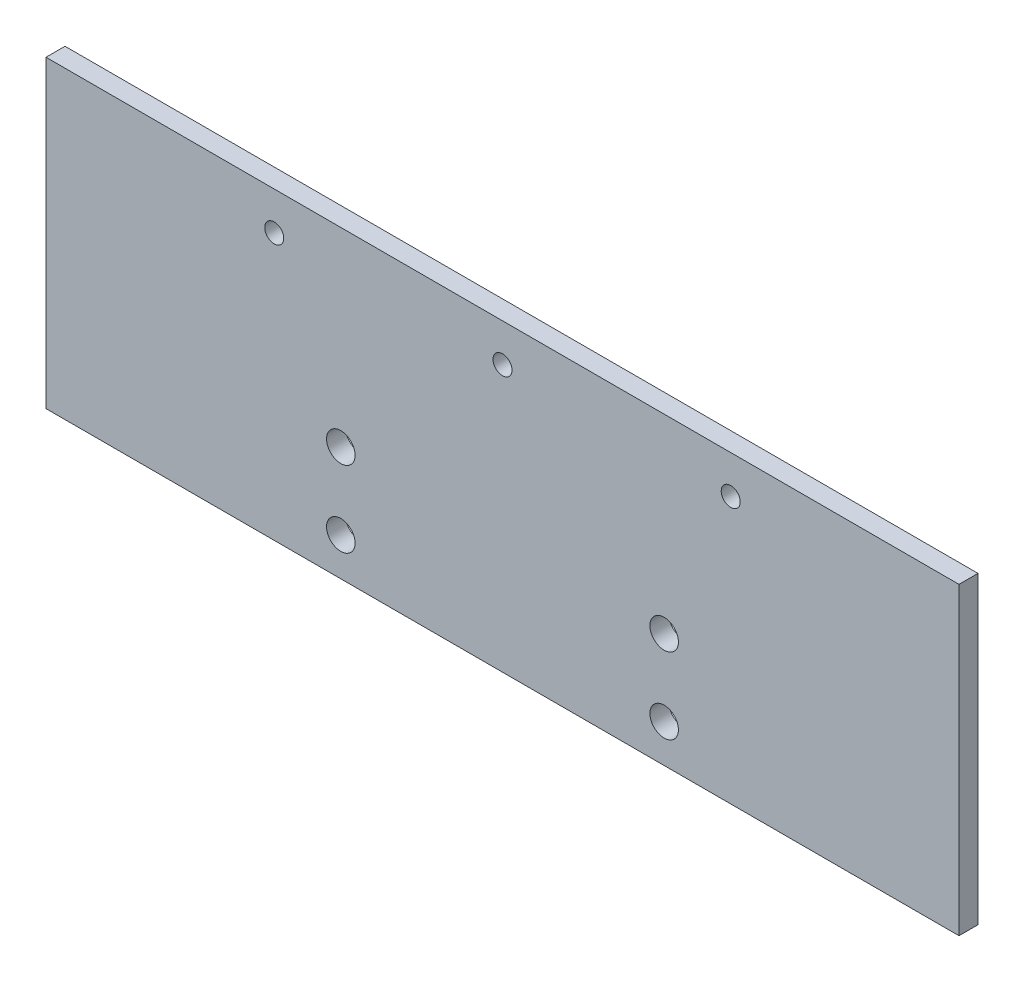
ISO-10303-21;
HEADER;
FILE_DESCRIPTION(('STEP AP214'),'2;1');
FILE_NAME('part.step','',(''),(''),'','','');
FILE_SCHEMA(('AUTOMOTIVE_DESIGN { 1 0 10303 214 1 1 1 1 }'));
ENDSEC;
DATA;
#1=APPLICATION_CONTEXT('core data for automotive mechanical design processes');
#2=APPLICATION_PROTOCOL_DEFINITION('international standard','automotive_design',2000,#1);
#3=PRODUCT_CONTEXT('',#1,'mechanical');
#4=PRODUCT('Part','Part','',(#3));
#5=PRODUCT_RELATED_PRODUCT_CATEGORY('part','',(#4));
#6=PRODUCT_DEFINITION_FORMATION('','',#4);
#7=PRODUCT_DEFINITION_CONTEXT('part definition',#1,'design');
#8=PRODUCT_DEFINITION('design','',#6,#7);
#9=PRODUCT_DEFINITION_SHAPE('','',#8);
#10=(LENGTH_UNIT() NAMED_UNIT(*) SI_UNIT(.MILLI.,.METRE.));
#11=(NAMED_UNIT(*) PLANE_ANGLE_UNIT() SI_UNIT($,.RADIAN.));
#12=(NAMED_UNIT(*) SI_UNIT($,.STERADIAN.) SOLID_ANGLE_UNIT());
#13=UNCERTAINTY_MEASURE_WITH_UNIT(LENGTH_MEASURE(1.E-05),#10,'distance_accuracy_value','');
#14=(GEOMETRIC_REPRESENTATION_CONTEXT(3) GLOBAL_UNCERTAINTY_ASSIGNED_CONTEXT((#13)) GLOBAL_UNIT_ASSIGNED_CONTEXT((#10,
#11,#12)) REPRESENTATION_CONTEXT('',''));
#15=CARTESIAN_POINT('',(0.,0.,0.));
#16=DIRECTION('',(0.,0.,1.));
#17=DIRECTION('',(1.,0.,0.));
#18=AXIS2_PLACEMENT_3D('',#15,#16,#17);
#19=CARTESIAN_POINT('',(0.,0.,6.35));
#20=DIRECTION('',(1.,0.,0.));
#21=DIRECTION('',(0.,1.,0.));
#22=AXIS2_PLACEMENT_3D('',#19,#20,#21);
#23=PLANE('',#22);
#24=DIRECTION('',(0.,-1.,0.));
#25=VECTOR('',#24,1.);
#26=CARTESIAN_POINT('',(0.,0.,0.));
#27=LINE('',#26,#25);
#28=CARTESIAN_POINT('',(0.,0.,0.));
#29=VERTEX_POINT('',#28);
#30=CARTESIAN_POINT('',(0.,-101.6,0.));
#31=VERTEX_POINT('',#30);
#32=EDGE_CURVE('E95',#29,#31,#27,.T.);
#33=ORIENTED_EDGE('',*,*,#32,.T.);
#34=DIRECTION('',(0.,0.,-1.));
#35=VECTOR('',#34,1.);
#36=CARTESIAN_POINT('',(0.,-101.6,6.35));
#37=LINE('',#36,#35);
#38=CARTESIAN_POINT('',(0.,-101.6,6.35));
#39=VERTEX_POINT('',#38);
#40=EDGE_CURVE('E11',#39,#31,#37,.T.);
#41=ORIENTED_EDGE('',*,*,#40,.F.);
#42=DIRECTION('',(0.,-1.,0.));
#43=VECTOR('',#42,1.);
#44=CARTESIAN_POINT('',(0.,0.,6.35));
#45=LINE('',#44,#43);
#46=CARTESIAN_POINT('',(0.,0.,6.35));
#47=VERTEX_POINT('',#46);
#48=EDGE_CURVE('E83',#47,#39,#45,.T.);
#49=ORIENTED_EDGE('',*,*,#48,.F.);
#50=DIRECTION('',(0.,0.,-1.));
#51=VECTOR('',#50,1.);
#52=CARTESIAN_POINT('',(0.,0.,6.35));
#53=LINE('',#52,#51);
#54=EDGE_CURVE('E91',#47,#29,#53,.T.);
#55=ORIENTED_EDGE('',*,*,#54,.T.);
#56=EDGE_LOOP('',(#33,#41,#49,#55));
#57=FACE_BOUND('',#56,.T.);
#58=ADVANCED_FACE('F32',(#57),#23,.F.);
#59=CARTESIAN_POINT('',(0.,-101.6,6.35));
#60=DIRECTION('',(0.,1.,0.));
#61=DIRECTION('',(0.,0.,1.));
#62=AXIS2_PLACEMENT_3D('',#59,#60,#61);
#63=PLANE('',#62);
#64=DIRECTION('',(1.,0.,0.));
#65=VECTOR('',#64,1.);
#66=CARTESIAN_POINT('',(0.,-101.6,0.));
#67=LINE('',#66,#65);
#68=CARTESIAN_POINT('',(304.8,-101.6,0.));
#69=VERTEX_POINT('',#68);
#70=EDGE_CURVE('E87',#31,#69,#67,.T.);
#71=ORIENTED_EDGE('',*,*,#70,.T.);
#72=DIRECTION('',(0.,0.,-1.));
#73=VECTOR('',#72,1.);
#74=CARTESIAN_POINT('',(304.8,-101.6,6.35));
#75=LINE('',#74,#73);
#76=CARTESIAN_POINT('',(304.8,-101.6,6.35));
#77=VERTEX_POINT('',#76);
#78=EDGE_CURVE('E40',#77,#69,#75,.T.);
#79=ORIENTED_EDGE('',*,*,#78,.F.);
#80=DIRECTION('',(1.,0.,0.));
#81=VECTOR('',#80,1.);
#82=CARTESIAN_POINT('',(0.,-101.6,6.35));
#83=LINE('',#82,#81);
#84=EDGE_CURVE('E78',#39,#77,#83,.T.);
#85=ORIENTED_EDGE('',*,*,#84,.F.);
#86=ORIENTED_EDGE('',*,*,#40,.T.);
#87=EDGE_LOOP('',(#71,#79,#85,#86));
#88=FACE_BOUND('',#87,.T.);
#89=ADVANCED_FACE('F86',(#88),#63,.F.);
#90=CARTESIAN_POINT('',(304.8,0.,6.35));
#91=DIRECTION('',(-1.,0.,0.));
#92=DIRECTION('',(0.,0.,1.));
#93=AXIS2_PLACEMENT_3D('',#90,#91,#92);
#94=PLANE('',#93);
#95=DIRECTION('',(0.,1.,0.));
#96=VECTOR('',#95,1.);
#97=CARTESIAN_POINT('',(304.8,0.,0.));
#98=LINE('',#97,#96);
#99=CARTESIAN_POINT('',(304.8,0.,0.));
#100=VERTEX_POINT('',#99);
#101=EDGE_CURVE('E65',#69,#100,#98,.T.);
#102=ORIENTED_EDGE('',*,*,#101,.T.);
#103=DIRECTION('',(0.,0.,-1.));
#104=VECTOR('',#103,1.);
#105=CARTESIAN_POINT('',(304.8,0.,6.35));
#106=LINE('',#105,#104);
#107=CARTESIAN_POINT('',(304.8,0.,6.35));
#108=VERTEX_POINT('',#107);
#109=EDGE_CURVE('E88',#108,#100,#106,.T.);
#110=ORIENTED_EDGE('',*,*,#109,.F.);
#111=DIRECTION('',(0.,1.,0.));
#112=VECTOR('',#111,1.);
#113=CARTESIAN_POINT('',(304.8,0.,6.35));
#114=LINE('',#113,#112);
#115=EDGE_CURVE('E81',#77,#108,#114,.T.);
#116=ORIENTED_EDGE('',*,*,#115,.F.);
#117=ORIENTED_EDGE('',*,*,#78,.T.);
#118=EDGE_LOOP('',(#102,#110,#116,#117));
#119=FACE_BOUND('',#118,.T.);
#120=ADVANCED_FACE('F89',(#119),#94,.F.);
#121=CARTESIAN_POINT('',(0.,0.,6.35));
#122=DIRECTION('',(0.,-1.,0.));
#123=DIRECTION('',(0.,0.,-1.));
#124=AXIS2_PLACEMENT_3D('',#121,#122,#123);
#125=PLANE('',#124);
#126=DIRECTION('',(-1.,0.,0.));
#127=VECTOR('',#126,1.);
#128=CARTESIAN_POINT('',(0.,0.,0.));
#129=LINE('',#128,#127);
#130=EDGE_CURVE('E71',#100,#29,#129,.T.);
#131=ORIENTED_EDGE('',*,*,#130,.T.);
#132=ORIENTED_EDGE('',*,*,#54,.F.);
#133=DIRECTION('',(-1.,0.,0.));
#134=VECTOR('',#133,1.);
#135=CARTESIAN_POINT('',(0.,0.,6.35));
#136=LINE('',#135,#134);
#137=EDGE_CURVE('E48',#108,#47,#136,.T.);
#138=ORIENTED_EDGE('',*,*,#137,.F.);
#139=ORIENTED_EDGE('',*,*,#109,.T.);
#140=EDGE_LOOP('',(#131,#132,#138,#139));
#141=FACE_BOUND('',#140,.T.);
#142=ADVANCED_FACE('F103',(#141),#125,.F.);
#143=CARTESIAN_POINT('',(0.,0.,6.35));
#144=DIRECTION('',(0.,0.,1.));
#145=DIRECTION('',(1.,0.,0.));
#146=AXIS2_PLACEMENT_3D('',#143,#144,#145);
#147=PLANE('',#146);
#148=CARTESIAN_POINT('',(206.375,-88.9,6.35));
#149=DIRECTION('',(0.,0.,1.));
#150=DIRECTION('',(1.,0.,0.));
#151=AXIS2_PLACEMENT_3D('',#148,#149,#150);
#152=CIRCLE('',#151,4.76250000000001);
#153=CARTESIAN_POINT('',(211.1375,-88.9,6.35));
#154=VERTEX_POINT('',#153);
#155=EDGE_CURVE('E133',#154,#154,#152,.T.);
#156=ORIENTED_EDGE('',*,*,#155,.F.);
#157=EDGE_LOOP('',(#156));
#158=FACE_BOUND('',#157,.T.);
#159=CARTESIAN_POINT('',(98.425,-88.9,6.35));
#160=DIRECTION('',(0.,0.,1.));
#161=DIRECTION('',(1.,0.,0.));
#162=AXIS2_PLACEMENT_3D('',#159,#160,#161);
#163=CIRCLE('',#162,4.7625);
#164=CARTESIAN_POINT('',(103.1875,-88.9,6.35));
#165=VERTEX_POINT('',#164);
#166=EDGE_CURVE('E139',#165,#165,#163,.T.);
#167=ORIENTED_EDGE('',*,*,#166,.F.);
#168=EDGE_LOOP('',(#167));
#169=FACE_BOUND('',#168,.T.);
#170=CARTESIAN_POINT('',(206.375,-63.5,6.35));
#171=DIRECTION('',(0.,0.,1.));
#172=DIRECTION('',(1.,0.,0.));
#173=AXIS2_PLACEMENT_3D('',#170,#171,#172);
#174=CIRCLE('',#173,4.76250000000001);
#175=CARTESIAN_POINT('',(211.1375,-63.5,6.35));
#176=VERTEX_POINT('',#175);
#177=EDGE_CURVE('E145',#176,#176,#174,.T.);
#178=ORIENTED_EDGE('',*,*,#177,.F.);
#179=EDGE_LOOP('',(#178));
#180=FACE_BOUND('',#179,.T.);
#181=CARTESIAN_POINT('',(152.4,-12.7,6.35));
#182=DIRECTION('',(0.,0.,1.));
#183=DIRECTION('',(1.,0.,0.));
#184=AXIS2_PLACEMENT_3D('',#181,#182,#183);
#185=CIRCLE('',#184,3.175);
#186=CARTESIAN_POINT('',(155.575,-12.7,6.35));
#187=VERTEX_POINT('',#186);
#188=EDGE_CURVE('E115',#187,#187,#185,.T.);
#189=ORIENTED_EDGE('',*,*,#188,.F.);
#190=EDGE_LOOP('',(#189));
#191=FACE_BOUND('',#190,.T.);
#192=CARTESIAN_POINT('',(228.6,-12.7,6.35));
#193=DIRECTION('',(0.,0.,1.));
#194=DIRECTION('',(1.,0.,0.));
#195=AXIS2_PLACEMENT_3D('',#192,#193,#194);
#196=CIRCLE('',#195,3.175);
#197=CARTESIAN_POINT('',(231.775,-12.7,6.35));
#198=VERTEX_POINT('',#197);
#199=EDGE_CURVE('E128',#198,#198,#196,.T.);
#200=ORIENTED_EDGE('',*,*,#199,.F.);
#201=EDGE_LOOP('',(#200));
#202=FACE_BOUND('',#201,.T.);
#203=CARTESIAN_POINT('',(98.425,-63.5,6.35));
#204=DIRECTION('',(0.,0.,1.));
#205=DIRECTION('',(1.,0.,0.));
#206=AXIS2_PLACEMENT_3D('',#203,#204,#205);
#207=CIRCLE('',#206,4.7625);
#208=CARTESIAN_POINT('',(103.1875,-63.5,6.35));
#209=VERTEX_POINT('',#208);
#210=EDGE_CURVE('E121',#209,#209,#207,.T.);
#211=ORIENTED_EDGE('',*,*,#210,.F.);
#212=EDGE_LOOP('',(#211));
#213=FACE_BOUND('',#212,.T.);
#214=CARTESIAN_POINT('',(76.2,-12.7,6.35));
#215=DIRECTION('',(0.,0.,1.));
#216=DIRECTION('',(1.,0.,0.));
#217=AXIS2_PLACEMENT_3D('',#214,#215,#216);
#218=CIRCLE('',#217,3.175);
#219=CARTESIAN_POINT('',(79.375,-12.7,6.35));
#220=VERTEX_POINT('',#219);
#221=EDGE_CURVE('E109',#220,#220,#218,.T.);
#222=ORIENTED_EDGE('',*,*,#221,.F.);
#223=EDGE_LOOP('',(#222));
#224=FACE_BOUND('',#223,.T.);
#225=ORIENTED_EDGE('',*,*,#48,.T.);
#226=ORIENTED_EDGE('',*,*,#84,.T.);
#227=ORIENTED_EDGE('',*,*,#115,.T.);
#228=ORIENTED_EDGE('',*,*,#137,.T.);
#229=EDGE_LOOP('',(#225,#226,#227,#228));
#230=FACE_BOUND('',#229,.T.);
#231=ADVANCED_FACE('F79',(#158,#169,#180,#191,#202,#213,#224,#230),#147,.T.);
#232=CARTESIAN_POINT('',(0.,0.,0.));
#233=DIRECTION('',(0.,0.,1.));
#234=DIRECTION('',(1.,0.,0.));
#235=AXIS2_PLACEMENT_3D('',#232,#233,#234);
#236=PLANE('',#235);
#237=CARTESIAN_POINT('',(206.375,-88.9,0.));
#238=DIRECTION('',(0.,0.,1.));
#239=DIRECTION('',(1.,0.,0.));
#240=AXIS2_PLACEMENT_3D('',#237,#238,#239);
#241=CIRCLE('',#240,4.76250000000001);
#242=CARTESIAN_POINT('',(211.1375,-88.9,0.));
#243=VERTEX_POINT('',#242);
#244=EDGE_CURVE('E136',#243,#243,#241,.T.);
#245=ORIENTED_EDGE('',*,*,#244,.T.);
#246=EDGE_LOOP('',(#245));
#247=FACE_BOUND('',#246,.T.);
#248=CARTESIAN_POINT('',(98.425,-88.9,0.));
#249=DIRECTION('',(0.,0.,1.));
#250=DIRECTION('',(1.,0.,0.));
#251=AXIS2_PLACEMENT_3D('',#248,#249,#250);
#252=CIRCLE('',#251,4.7625);
#253=CARTESIAN_POINT('',(103.1875,-88.9,0.));
#254=VERTEX_POINT('',#253);
#255=EDGE_CURVE('E142',#254,#254,#252,.T.);
#256=ORIENTED_EDGE('',*,*,#255,.T.);
#257=EDGE_LOOP('',(#256));
#258=FACE_BOUND('',#257,.T.);
#259=CARTESIAN_POINT('',(206.375,-63.5,0.));
#260=DIRECTION('',(0.,0.,1.));
#261=DIRECTION('',(1.,0.,0.));
#262=AXIS2_PLACEMENT_3D('',#259,#260,#261);
#263=CIRCLE('',#262,4.76250000000001);
#264=CARTESIAN_POINT('',(211.1375,-63.5,0.));
#265=VERTEX_POINT('',#264);
#266=EDGE_CURVE('E125',#265,#265,#263,.T.);
#267=ORIENTED_EDGE('',*,*,#266,.T.);
#268=EDGE_LOOP('',(#267));
#269=FACE_BOUND('',#268,.T.);
#270=CARTESIAN_POINT('',(152.4,-12.7,0.));
#271=DIRECTION('',(0.,0.,1.));
#272=DIRECTION('',(1.,0.,0.));
#273=AXIS2_PLACEMENT_3D('',#270,#271,#272);
#274=CIRCLE('',#273,3.175);
#275=CARTESIAN_POINT('',(155.575,-12.7,0.));
#276=VERTEX_POINT('',#275);
#277=EDGE_CURVE('E112',#276,#276,#274,.T.);
#278=ORIENTED_EDGE('',*,*,#277,.T.);
#279=EDGE_LOOP('',(#278));
#280=FACE_BOUND('',#279,.T.);
#281=CARTESIAN_POINT('',(228.6,-12.7,0.));
#282=DIRECTION('',(0.,0.,1.));
#283=DIRECTION('',(1.,0.,0.));
#284=AXIS2_PLACEMENT_3D('',#281,#282,#283);
#285=CIRCLE('',#284,3.175);
#286=CARTESIAN_POINT('',(231.775,-12.7,0.));
#287=VERTEX_POINT('',#286);
#288=EDGE_CURVE('E118',#287,#287,#285,.T.);
#289=ORIENTED_EDGE('',*,*,#288,.T.);
#290=EDGE_LOOP('',(#289));
#291=FACE_BOUND('',#290,.T.);
#292=CARTESIAN_POINT('',(98.425,-63.5,0.));
#293=DIRECTION('',(0.,0.,1.));
#294=DIRECTION('',(1.,0.,0.));
#295=AXIS2_PLACEMENT_3D('',#292,#293,#294);
#296=CIRCLE('',#295,4.7625);
#297=CARTESIAN_POINT('',(103.1875,-63.5,0.));
#298=VERTEX_POINT('',#297);
#299=EDGE_CURVE('E124',#298,#298,#296,.T.);
#300=ORIENTED_EDGE('',*,*,#299,.T.);
#301=EDGE_LOOP('',(#300));
#302=FACE_BOUND('',#301,.T.);
#303=CARTESIAN_POINT('',(76.2,-12.7,0.));
#304=DIRECTION('',(0.,0.,1.));
#305=DIRECTION('',(1.,0.,0.));
#306=AXIS2_PLACEMENT_3D('',#303,#304,#305);
#307=CIRCLE('',#306,3.175);
#308=CARTESIAN_POINT('',(79.375,-12.7,0.));
#309=VERTEX_POINT('',#308);
#310=EDGE_CURVE('E98',#309,#309,#307,.T.);
#311=ORIENTED_EDGE('',*,*,#310,.T.);
#312=EDGE_LOOP('',(#311));
#313=FACE_BOUND('',#312,.T.);
#314=ORIENTED_EDGE('',*,*,#32,.F.);
#315=ORIENTED_EDGE('',*,*,#130,.F.);
#316=ORIENTED_EDGE('',*,*,#101,.F.);
#317=ORIENTED_EDGE('',*,*,#70,.F.);
#318=EDGE_LOOP('',(#314,#315,#316,#317));
#319=FACE_BOUND('',#318,.T.);
#320=ADVANCED_FACE('F106',(#247,#258,#269,#280,#291,#302,#313,#319),#236,.F.);
#321=CARTESIAN_POINT('',(76.2,-12.7,0.));
#322=DIRECTION('',(0.,0.,1.));
#323=DIRECTION('',(1.,0.,0.));
#324=AXIS2_PLACEMENT_3D('',#321,#322,#323);
#325=CYLINDRICAL_SURFACE('',#324,3.175);
#326=ORIENTED_EDGE('',*,*,#310,.F.);
#327=EDGE_LOOP('',(#326));
#328=FACE_BOUND('',#327,.T.);
#329=ORIENTED_EDGE('',*,*,#221,.T.);
#330=EDGE_LOOP('',(#329));
#331=FACE_BOUND('',#330,.T.);
#332=ADVANCED_FACE('F173',(#328,#331),#325,.F.);
#333=CARTESIAN_POINT('',(98.425,-63.5,0.));
#334=DIRECTION('',(0.,0.,1.));
#335=DIRECTION('',(1.,0.,0.));
#336=AXIS2_PLACEMENT_3D('',#333,#334,#335);
#337=CYLINDRICAL_SURFACE('',#336,4.7625);
#338=ORIENTED_EDGE('',*,*,#299,.F.);
#339=EDGE_LOOP('',(#338));
#340=FACE_BOUND('',#339,.T.);
#341=ORIENTED_EDGE('',*,*,#210,.T.);
#342=EDGE_LOOP('',(#341));
#343=FACE_BOUND('',#342,.T.);
#344=ADVANCED_FACE('F175',(#340,#343),#337,.F.);
#345=CARTESIAN_POINT('',(228.6,-12.7,0.));
#346=DIRECTION('',(0.,0.,1.));
#347=DIRECTION('',(1.,0.,0.));
#348=AXIS2_PLACEMENT_3D('',#345,#346,#347);
#349=CYLINDRICAL_SURFACE('',#348,3.175);
#350=ORIENTED_EDGE('',*,*,#288,.F.);
#351=EDGE_LOOP('',(#350));
#352=FACE_BOUND('',#351,.T.);
#353=ORIENTED_EDGE('',*,*,#199,.T.);
#354=EDGE_LOOP('',(#353));
#355=FACE_BOUND('',#354,.T.);
#356=ADVANCED_FACE('F182',(#352,#355),#349,.F.);
#357=CARTESIAN_POINT('',(152.4,-12.7,0.));
#358=DIRECTION('',(0.,0.,1.));
#359=DIRECTION('',(1.,0.,0.));
#360=AXIS2_PLACEMENT_3D('',#357,#358,#359);
#361=CYLINDRICAL_SURFACE('',#360,3.175);
#362=ORIENTED_EDGE('',*,*,#277,.F.);
#363=EDGE_LOOP('',(#362));
#364=FACE_BOUND('',#363,.T.);
#365=ORIENTED_EDGE('',*,*,#188,.T.);
#366=EDGE_LOOP('',(#365));
#367=FACE_BOUND('',#366,.T.);
#368=ADVANCED_FACE('F157',(#364,#367),#361,.F.);
#369=CARTESIAN_POINT('',(206.375,-63.5,0.));
#370=DIRECTION('',(0.,0.,1.));
#371=DIRECTION('',(1.,0.,0.));
#372=AXIS2_PLACEMENT_3D('',#369,#370,#371);
#373=CYLINDRICAL_SURFACE('',#372,4.76250000000001);
#374=ORIENTED_EDGE('',*,*,#266,.F.);
#375=EDGE_LOOP('',(#374));
#376=FACE_BOUND('',#375,.T.);
#377=ORIENTED_EDGE('',*,*,#177,.T.);
#378=EDGE_LOOP('',(#377));
#379=FACE_BOUND('',#378,.T.);
#380=ADVANCED_FACE('F153',(#376,#379),#373,.F.);
#381=CARTESIAN_POINT('',(98.425,-88.9,0.));
#382=DIRECTION('',(0.,0.,1.));
#383=DIRECTION('',(1.,0.,0.));
#384=AXIS2_PLACEMENT_3D('',#381,#382,#383);
#385=CYLINDRICAL_SURFACE('',#384,4.7625);
#386=ORIENTED_EDGE('',*,*,#255,.F.);
#387=EDGE_LOOP('',(#386));
#388=FACE_BOUND('',#387,.T.);
#389=ORIENTED_EDGE('',*,*,#166,.T.);
#390=EDGE_LOOP('',(#389));
#391=FACE_BOUND('',#390,.T.);
#392=ADVANCED_FACE('F156',(#388,#391),#385,.F.);
#393=CARTESIAN_POINT('',(206.375,-88.9,0.));
#394=DIRECTION('',(0.,0.,1.));
#395=DIRECTION('',(1.,0.,0.));
#396=AXIS2_PLACEMENT_3D('',#393,#394,#395);
#397=CYLINDRICAL_SURFACE('',#396,4.76250000000001);
#398=ORIENTED_EDGE('',*,*,#244,.F.);
#399=EDGE_LOOP('',(#398));
#400=FACE_BOUND('',#399,.T.);
#401=ORIENTED_EDGE('',*,*,#155,.T.);
#402=EDGE_LOOP('',(#401));
#403=FACE_BOUND('',#402,.T.);
#404=ADVANCED_FACE('F253',(#400,#403),#397,.F.);
#405=CLOSED_SHELL('',(#58,#89,#120,#142,#231,#320,#332,#344,#356,#368,#380,#392,#404));
#406=MANIFOLD_SOLID_BREP('B2',#405);
#407=ADVANCED_BREP_SHAPE_REPRESENTATION('',(#18,#406),#14);
#408=SHAPE_DEFINITION_REPRESENTATION(#9,#407);
ENDSEC;
END-ISO-10303-21;
